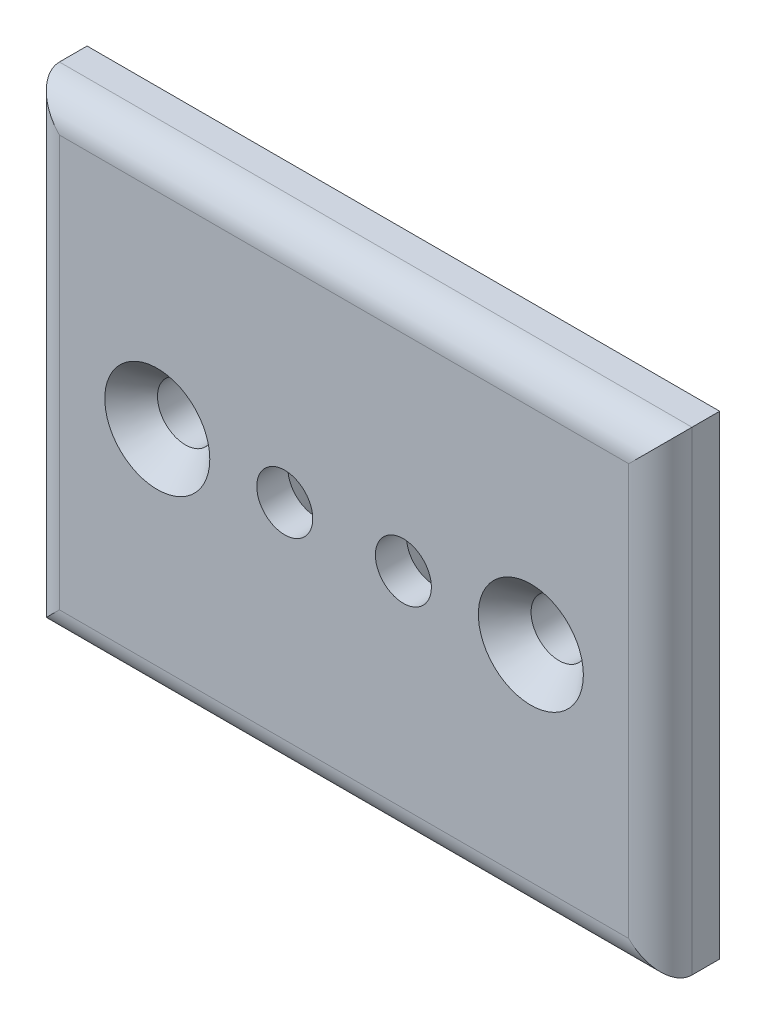
ISO-10303-21;
HEADER;
FILE_DESCRIPTION(('STEP AP214'),'2;1');
FILE_NAME('part.step','',(''),(''),'','','');
FILE_SCHEMA(('AUTOMOTIVE_DESIGN { 1 0 10303 214 1 1 1 1 }'));
ENDSEC;
DATA;
#1=APPLICATION_CONTEXT('core data for automotive mechanical design processes');
#2=APPLICATION_PROTOCOL_DEFINITION('international standard','automotive_design',2000,#1);
#3=PRODUCT_CONTEXT('',#1,'mechanical');
#4=PRODUCT('Part','Part','',(#3));
#5=PRODUCT_RELATED_PRODUCT_CATEGORY('part','',(#4));
#6=PRODUCT_DEFINITION_FORMATION('','',#4);
#7=PRODUCT_DEFINITION_CONTEXT('part definition',#1,'design');
#8=PRODUCT_DEFINITION('design','',#6,#7);
#9=PRODUCT_DEFINITION_SHAPE('','',#8);
#10=(LENGTH_UNIT() NAMED_UNIT(*) SI_UNIT(.MILLI.,.METRE.));
#11=(NAMED_UNIT(*) PLANE_ANGLE_UNIT() SI_UNIT($,.RADIAN.));
#12=(NAMED_UNIT(*) SI_UNIT($,.STERADIAN.) SOLID_ANGLE_UNIT());
#13=UNCERTAINTY_MEASURE_WITH_UNIT(LENGTH_MEASURE(1.E-05),#10,'distance_accuracy_value','');
#14=(GEOMETRIC_REPRESENTATION_CONTEXT(3) GLOBAL_UNCERTAINTY_ASSIGNED_CONTEXT((#13)) GLOBAL_UNIT_ASSIGNED_CONTEXT((#10,
#11,#12)) REPRESENTATION_CONTEXT('',''));
#15=CARTESIAN_POINT('',(0.,0.,0.));
#16=DIRECTION('',(0.,0.,1.));
#17=DIRECTION('',(1.,0.,0.));
#18=AXIS2_PLACEMENT_3D('',#15,#16,#17);
#19=CARTESIAN_POINT('',(25.4,19.05,4.7625));
#20=DIRECTION('',(-1.,0.,0.));
#21=DIRECTION('',(0.,-1.,0.));
#22=AXIS2_PLACEMENT_3D('',#19,#20,#21);
#23=PLANE('',#22);
#24=DIRECTION('',(0.,0.,-1.));
#25=VECTOR('',#24,1.);
#26=CARTESIAN_POINT('',(25.4,19.05,4.7625));
#27=LINE('',#26,#25);
#28=CARTESIAN_POINT('',(25.4,19.05,2.2225));
#29=VERTEX_POINT('',#28);
#30=CARTESIAN_POINT('',(25.4,19.05,0.));
#31=VERTEX_POINT('',#30);
#32=EDGE_CURVE('E86',#29,#31,#27,.T.);
#33=ORIENTED_EDGE('',*,*,#32,.F.);
#34=DIRECTION('',(0.,1.,0.));
#35=VECTOR('',#34,1.);
#36=CARTESIAN_POINT('',(25.4,-19.05,2.2225));
#37=LINE('',#36,#35);
#38=CARTESIAN_POINT('',(25.4,-19.05,2.2225));
#39=VERTEX_POINT('',#38);
#40=EDGE_CURVE('E56',#29,#39,#37,.F.);
#41=ORIENTED_EDGE('',*,*,#40,.T.);
#42=DIRECTION('',(0.,0.,-1.));
#43=VECTOR('',#42,1.);
#44=CARTESIAN_POINT('',(25.4,-19.05,4.7625));
#45=LINE('',#44,#43);
#46=CARTESIAN_POINT('',(25.4,-19.05,0.));
#47=VERTEX_POINT('',#46);
#48=EDGE_CURVE('E106',#39,#47,#45,.T.);
#49=ORIENTED_EDGE('',*,*,#48,.T.);
#50=DIRECTION('',(0.,1.,0.));
#51=VECTOR('',#50,1.);
#52=CARTESIAN_POINT('',(25.4,19.05,0.));
#53=LINE('',#52,#51);
#54=EDGE_CURVE('E102',#47,#31,#53,.T.);
#55=ORIENTED_EDGE('',*,*,#54,.T.);
#56=EDGE_LOOP('',(#33,#41,#49,#55));
#57=FACE_BOUND('',#56,.T.);
#58=ADVANCED_FACE('F32',(#57),#23,.F.);
#59=CARTESIAN_POINT('',(-25.4,19.05,4.7625));
#60=DIRECTION('',(0.,-1.,0.));
#61=DIRECTION('',(0.,0.,-1.));
#62=AXIS2_PLACEMENT_3D('',#59,#60,#61);
#63=PLANE('',#62);
#64=DIRECTION('',(0.,0.,-1.));
#65=VECTOR('',#64,1.);
#66=CARTESIAN_POINT('',(-25.4,19.05,4.7625));
#67=LINE('',#66,#65);
#68=CARTESIAN_POINT('',(-25.4,19.05,2.2225));
#69=VERTEX_POINT('',#68);
#70=CARTESIAN_POINT('',(-25.4,19.05,0.));
#71=VERTEX_POINT('',#70);
#72=EDGE_CURVE('E96',#69,#71,#67,.T.);
#73=ORIENTED_EDGE('',*,*,#72,.F.);
#74=DIRECTION('',(-1.,0.,0.));
#75=VECTOR('',#74,1.);
#76=CARTESIAN_POINT('',(25.4,19.05,2.2225));
#77=LINE('',#76,#75);
#78=EDGE_CURVE('E93',#69,#29,#77,.F.);
#79=ORIENTED_EDGE('',*,*,#78,.T.);
#80=ORIENTED_EDGE('',*,*,#32,.T.);
#81=DIRECTION('',(-1.,0.,0.));
#82=VECTOR('',#81,1.);
#83=CARTESIAN_POINT('',(-25.4,19.05,0.));
#84=LINE('',#83,#82);
#85=EDGE_CURVE('E90',#31,#71,#84,.T.);
#86=ORIENTED_EDGE('',*,*,#85,.T.);
#87=EDGE_LOOP('',(#73,#79,#80,#86));
#88=FACE_BOUND('',#87,.T.);
#89=ADVANCED_FACE('F89',(#88),#63,.F.);
#90=CARTESIAN_POINT('',(-25.4,19.05,4.7625));
#91=DIRECTION('',(1.,0.,0.));
#92=DIRECTION('',(0.,1.,0.));
#93=AXIS2_PLACEMENT_3D('',#90,#91,#92);
#94=PLANE('',#93);
#95=DIRECTION('',(0.,0.,-1.));
#96=VECTOR('',#95,1.);
#97=CARTESIAN_POINT('',(-25.4,-19.05,4.7625));
#98=LINE('',#97,#96);
#99=CARTESIAN_POINT('',(-25.4,-19.05,2.2225));
#100=VERTEX_POINT('',#99);
#101=CARTESIAN_POINT('',(-25.4,-19.05,0.));
#102=VERTEX_POINT('',#101);
#103=EDGE_CURVE('E119',#100,#102,#98,.T.);
#104=ORIENTED_EDGE('',*,*,#103,.F.);
#105=DIRECTION('',(0.,-1.,0.));
#106=VECTOR('',#105,1.);
#107=CARTESIAN_POINT('',(-25.4,19.05,2.2225));
#108=LINE('',#107,#106);
#109=EDGE_CURVE('E11',#100,#69,#108,.F.);
#110=ORIENTED_EDGE('',*,*,#109,.T.);
#111=ORIENTED_EDGE('',*,*,#72,.T.);
#112=DIRECTION('',(0.,-1.,0.));
#113=VECTOR('',#112,1.);
#114=CARTESIAN_POINT('',(-25.4,19.05,0.));
#115=LINE('',#114,#113);
#116=EDGE_CURVE('E104',#71,#102,#115,.T.);
#117=ORIENTED_EDGE('',*,*,#116,.T.);
#118=EDGE_LOOP('',(#104,#110,#111,#117));
#119=FACE_BOUND('',#118,.T.);
#120=ADVANCED_FACE('F201',(#119),#94,.F.);
#121=CARTESIAN_POINT('',(-25.4,-19.05,4.7625));
#122=DIRECTION('',(0.,1.,0.));
#123=DIRECTION('',(0.,0.,1.));
#124=AXIS2_PLACEMENT_3D('',#121,#122,#123);
#125=PLANE('',#124);
#126=ORIENTED_EDGE('',*,*,#48,.F.);
#127=DIRECTION('',(1.,0.,0.));
#128=VECTOR('',#127,1.);
#129=CARTESIAN_POINT('',(-25.4,-19.05,2.2225));
#130=LINE('',#129,#128);
#131=EDGE_CURVE('E41',#39,#100,#130,.F.);
#132=ORIENTED_EDGE('',*,*,#131,.T.);
#133=ORIENTED_EDGE('',*,*,#103,.T.);
#134=DIRECTION('',(1.,0.,0.));
#135=VECTOR('',#134,1.);
#136=CARTESIAN_POINT('',(-25.4,-19.05,0.));
#137=LINE('',#136,#135);
#138=EDGE_CURVE('E116',#102,#47,#137,.T.);
#139=ORIENTED_EDGE('',*,*,#138,.T.);
#140=EDGE_LOOP('',(#126,#132,#133,#139));
#141=FACE_BOUND('',#140,.T.);
#142=ADVANCED_FACE('F192',(#141),#125,.F.);
#143=CARTESIAN_POINT('',(25.4,-19.05,4.7625));
#144=DIRECTION('',(0.,0.,1.));
#145=DIRECTION('',(1.,0.,0.));
#146=AXIS2_PLACEMENT_3D('',#143,#144,#145);
#147=PLANE('',#146);
#148=DIRECTION('',(0.,1.,0.));
#149=VECTOR('',#148,1.);
#150=CARTESIAN_POINT('',(22.86,19.05,4.7625));
#151=LINE('',#150,#149);
#152=CARTESIAN_POINT('',(22.86,-16.51,4.7625));
#153=VERTEX_POINT('',#152);
#154=CARTESIAN_POINT('',(22.86,16.51,4.7625));
#155=VERTEX_POINT('',#154);
#156=EDGE_CURVE('E125',#153,#155,#151,.T.);
#157=ORIENTED_EDGE('',*,*,#156,.T.);
#158=DIRECTION('',(-1.,0.,0.));
#159=VECTOR('',#158,1.);
#160=CARTESIAN_POINT('',(-25.4,16.51,4.7625));
#161=LINE('',#160,#159);
#162=CARTESIAN_POINT('',(-22.86,16.51,4.7625));
#163=VERTEX_POINT('',#162);
#164=EDGE_CURVE('E127',#155,#163,#161,.T.);
#165=ORIENTED_EDGE('',*,*,#164,.T.);
#166=DIRECTION('',(0.,-1.,0.));
#167=VECTOR('',#166,1.);
#168=CARTESIAN_POINT('',(-22.86,-19.05,4.7625));
#169=LINE('',#168,#167);
#170=CARTESIAN_POINT('',(-22.86,-16.51,4.7625));
#171=VERTEX_POINT('',#170);
#172=EDGE_CURVE('E95',#163,#171,#169,.T.);
#173=ORIENTED_EDGE('',*,*,#172,.T.);
#174=DIRECTION('',(1.,0.,0.));
#175=VECTOR('',#174,1.);
#176=CARTESIAN_POINT('',(25.4,-16.51,4.7625));
#177=LINE('',#176,#175);
#178=EDGE_CURVE('E123',#171,#153,#177,.T.);
#179=ORIENTED_EDGE('',*,*,#178,.T.);
#180=EDGE_LOOP('',(#157,#165,#173,#179));
#181=FACE_BOUND('',#180,.T.);
#182=CARTESIAN_POINT('',(4.76249999999999,0.,4.7625));
#183=DIRECTION('',(0.,0.,-1.));
#184=DIRECTION('',(-1.,0.,0.));
#185=AXIS2_PLACEMENT_3D('',#182,#183,#184);
#186=CIRCLE('',#185,2.2479);
#187=CARTESIAN_POINT('',(2.51459999999999,0.,4.7625));
#188=VERTEX_POINT('',#187);
#189=EDGE_CURVE('E153',#188,#188,#186,.T.);
#190=ORIENTED_EDGE('',*,*,#189,.T.);
#191=EDGE_LOOP('',(#190));
#192=FACE_BOUND('',#191,.T.);
#193=CARTESIAN_POINT('',(-4.76250000000001,0.,4.7625));
#194=DIRECTION('',(0.,0.,-1.));
#195=DIRECTION('',(-1.,0.,0.));
#196=AXIS2_PLACEMENT_3D('',#193,#194,#195);
#197=CIRCLE('',#196,2.2479);
#198=CARTESIAN_POINT('',(-7.01040000000001,0.,4.7625));
#199=VERTEX_POINT('',#198);
#200=EDGE_CURVE('E164',#199,#199,#197,.T.);
#201=ORIENTED_EDGE('',*,*,#200,.T.);
#202=EDGE_LOOP('',(#201));
#203=FACE_BOUND('',#202,.T.);
#204=CARTESIAN_POINT('',(-15.,0.,4.7625));
#205=DIRECTION('',(0.,0.,1.));
#206=DIRECTION('',(1.,0.,0.));
#207=AXIS2_PLACEMENT_3D('',#204,#205,#206);
#208=CIRCLE('',#207,4.2164);
#209=CARTESIAN_POINT('',(-10.7836,0.,4.7625));
#210=VERTEX_POINT('',#209);
#211=EDGE_CURVE('E167',#210,#210,#208,.T.);
#212=ORIENTED_EDGE('',*,*,#211,.F.);
#213=EDGE_LOOP('',(#212));
#214=FACE_BOUND('',#213,.T.);
#215=CARTESIAN_POINT('',(15.,0.,4.7625));
#216=DIRECTION('',(0.,0.,1.));
#217=DIRECTION('',(1.,0.,0.));
#218=AXIS2_PLACEMENT_3D('',#215,#216,#217);
#219=CIRCLE('',#218,4.2164);
#220=CARTESIAN_POINT('',(19.2164,0.,4.7625));
#221=VERTEX_POINT('',#220);
#222=EDGE_CURVE('E176',#221,#221,#219,.T.);
#223=ORIENTED_EDGE('',*,*,#222,.F.);
#224=EDGE_LOOP('',(#223));
#225=FACE_BOUND('',#224,.T.);
#226=ADVANCED_FACE('F190',(#181,#192,#203,#214,#225),#147,.T.);
#227=CARTESIAN_POINT('',(25.4,-19.05,0.));
#228=DIRECTION('',(0.,0.,1.));
#229=DIRECTION('',(1.,0.,0.));
#230=AXIS2_PLACEMENT_3D('',#227,#228,#229);
#231=PLANE('',#230);
#232=CARTESIAN_POINT('',(4.76249999999999,0.,0.));
#233=DIRECTION('',(0.,0.,-1.));
#234=DIRECTION('',(-1.,0.,0.));
#235=AXIS2_PLACEMENT_3D('',#232,#233,#234);
#236=CIRCLE('',#235,4.2164);
#237=CARTESIAN_POINT('',(0.546099999999992,0.,0.));
#238=VERTEX_POINT('',#237);
#239=EDGE_CURVE('E143',#238,#238,#236,.T.);
#240=ORIENTED_EDGE('',*,*,#239,.F.);
#241=EDGE_LOOP('',(#240));
#242=FACE_BOUND('',#241,.T.);
#243=CARTESIAN_POINT('',(-4.76250000000001,0.,0.));
#244=DIRECTION('',(0.,0.,-1.));
#245=DIRECTION('',(-1.,0.,0.));
#246=AXIS2_PLACEMENT_3D('',#243,#244,#245);
#247=CIRCLE('',#246,4.2164);
#248=CARTESIAN_POINT('',(-8.97890000000001,0.,0.));
#249=VERTEX_POINT('',#248);
#250=EDGE_CURVE('E158',#249,#249,#247,.T.);
#251=ORIENTED_EDGE('',*,*,#250,.F.);
#252=EDGE_LOOP('',(#251));
#253=FACE_BOUND('',#252,.T.);
#254=CARTESIAN_POINT('',(-15.,0.,0.));
#255=DIRECTION('',(0.,0.,1.));
#256=DIRECTION('',(1.,0.,0.));
#257=AXIS2_PLACEMENT_3D('',#254,#255,#256);
#258=CIRCLE('',#257,2.2479);
#259=CARTESIAN_POINT('',(-12.7521,0.,0.));
#260=VERTEX_POINT('',#259);
#261=EDGE_CURVE('E173',#260,#260,#258,.T.);
#262=ORIENTED_EDGE('',*,*,#261,.T.);
#263=EDGE_LOOP('',(#262));
#264=FACE_BOUND('',#263,.T.);
#265=CARTESIAN_POINT('',(15.,0.,0.));
#266=DIRECTION('',(0.,0.,1.));
#267=DIRECTION('',(1.,0.,0.));
#268=AXIS2_PLACEMENT_3D('',#265,#266,#267);
#269=CIRCLE('',#268,2.2479);
#270=CARTESIAN_POINT('',(17.2479,0.,0.));
#271=VERTEX_POINT('',#270);
#272=EDGE_CURVE('E108',#271,#271,#269,.T.);
#273=ORIENTED_EDGE('',*,*,#272,.T.);
#274=EDGE_LOOP('',(#273));
#275=FACE_BOUND('',#274,.T.);
#276=ORIENTED_EDGE('',*,*,#54,.F.);
#277=ORIENTED_EDGE('',*,*,#138,.F.);
#278=ORIENTED_EDGE('',*,*,#116,.F.);
#279=ORIENTED_EDGE('',*,*,#85,.F.);
#280=EDGE_LOOP('',(#276,#277,#278,#279));
#281=FACE_BOUND('',#280,.T.);
#282=ADVANCED_FACE('F100',(#242,#253,#264,#275,#281),#231,.F.);
#283=CARTESIAN_POINT('',(15.,0.,4.7625));
#284=DIRECTION('',(0.,0.,1.));
#285=DIRECTION('',(1.,0.,0.));
#286=AXIS2_PLACEMENT_3D('',#283,#284,#285);
#287=CYLINDRICAL_SURFACE('',#286,2.2479);
#288=ORIENTED_EDGE('',*,*,#272,.F.);
#289=EDGE_LOOP('',(#288));
#290=FACE_BOUND('',#289,.T.);
#291=CARTESIAN_POINT('',(15.,0.,2.49799979038544));
#292=DIRECTION('',(0.,0.,1.));
#293=DIRECTION('',(1.,0.,0.));
#294=AXIS2_PLACEMENT_3D('',#291,#292,#293);
#295=CIRCLE('',#294,2.2479);
#296=CARTESIAN_POINT('',(17.2479,0.,2.49799979038544));
#297=VERTEX_POINT('',#296);
#298=EDGE_CURVE('E111',#297,#297,#295,.T.);
#299=ORIENTED_EDGE('',*,*,#298,.T.);
#300=EDGE_LOOP('',(#299));
#301=FACE_BOUND('',#300,.T.);
#302=ADVANCED_FACE('F181',(#290,#301),#287,.F.);
#303=CARTESIAN_POINT('',(15.,0.,4.7625));
#304=DIRECTION('',(0.,0.,1.));
#305=DIRECTION('',(1.,0.,0.));
#306=AXIS2_PLACEMENT_3D('',#303,#304,#305);
#307=CONICAL_SURFACE('',#306,4.2164,0.715584993317675);
#308=ORIENTED_EDGE('',*,*,#298,.F.);
#309=EDGE_LOOP('',(#308));
#310=FACE_BOUND('',#309,.T.);
#311=ORIENTED_EDGE('',*,*,#222,.T.);
#312=EDGE_LOOP('',(#311));
#313=FACE_BOUND('',#312,.T.);
#314=ADVANCED_FACE('F183',(#310,#313),#307,.F.);
#315=CARTESIAN_POINT('',(-15.,0.,4.7625));
#316=DIRECTION('',(0.,0.,1.));
#317=DIRECTION('',(1.,0.,0.));
#318=AXIS2_PLACEMENT_3D('',#315,#316,#317);
#319=CYLINDRICAL_SURFACE('',#318,2.2479);
#320=ORIENTED_EDGE('',*,*,#261,.F.);
#321=EDGE_LOOP('',(#320));
#322=FACE_BOUND('',#321,.T.);
#323=CARTESIAN_POINT('',(-15.,0.,2.49799979038544));
#324=DIRECTION('',(0.,0.,1.));
#325=DIRECTION('',(1.,0.,0.));
#326=AXIS2_PLACEMENT_3D('',#323,#324,#325);
#327=CIRCLE('',#326,2.2479);
#328=CARTESIAN_POINT('',(-12.7521,0.,2.49799979038544));
#329=VERTEX_POINT('',#328);
#330=EDGE_CURVE('E170',#329,#329,#327,.T.);
#331=ORIENTED_EDGE('',*,*,#330,.T.);
#332=EDGE_LOOP('',(#331));
#333=FACE_BOUND('',#332,.T.);
#334=ADVANCED_FACE('F186',(#322,#333),#319,.F.);
#335=CARTESIAN_POINT('',(-15.,0.,4.7625));
#336=DIRECTION('',(0.,0.,1.));
#337=DIRECTION('',(1.,0.,0.));
#338=AXIS2_PLACEMENT_3D('',#335,#336,#337);
#339=CONICAL_SURFACE('',#338,4.2164,0.715584993317675);
#340=ORIENTED_EDGE('',*,*,#330,.F.);
#341=EDGE_LOOP('',(#340));
#342=FACE_BOUND('',#341,.T.);
#343=ORIENTED_EDGE('',*,*,#211,.T.);
#344=EDGE_LOOP('',(#343));
#345=FACE_BOUND('',#344,.T.);
#346=ADVANCED_FACE('F304',(#342,#345),#339,.F.);
#347=CARTESIAN_POINT('',(-4.76250000000001,0.,0.));
#348=DIRECTION('',(0.,0.,-1.));
#349=DIRECTION('',(-1.,0.,0.));
#350=AXIS2_PLACEMENT_3D('',#347,#348,#349);
#351=CYLINDRICAL_SURFACE('',#350,2.2479);
#352=ORIENTED_EDGE('',*,*,#200,.F.);
#353=EDGE_LOOP('',(#352));
#354=FACE_BOUND('',#353,.T.);
#355=CARTESIAN_POINT('',(-4.76250000000001,0.,2.26450020961456));
#356=DIRECTION('',(0.,0.,-1.));
#357=DIRECTION('',(-1.,0.,0.));
#358=AXIS2_PLACEMENT_3D('',#355,#356,#357);
#359=CIRCLE('',#358,2.2479);
#360=CARTESIAN_POINT('',(-7.01040000000001,0.,2.26450020961456));
#361=VERTEX_POINT('',#360);
#362=EDGE_CURVE('E161',#361,#361,#359,.T.);
#363=ORIENTED_EDGE('',*,*,#362,.T.);
#364=EDGE_LOOP('',(#363));
#365=FACE_BOUND('',#364,.T.);
#366=ADVANCED_FACE('F295',(#354,#365),#351,.F.);
#367=CARTESIAN_POINT('',(-4.76250000000001,0.,0.));
#368=DIRECTION('',(0.,0.,-1.));
#369=DIRECTION('',(-1.,0.,0.));
#370=AXIS2_PLACEMENT_3D('',#367,#368,#369);
#371=CONICAL_SURFACE('',#370,4.2164,0.715584993317675);
#372=ORIENTED_EDGE('',*,*,#362,.F.);
#373=EDGE_LOOP('',(#372));
#374=FACE_BOUND('',#373,.T.);
#375=ORIENTED_EDGE('',*,*,#250,.T.);
#376=EDGE_LOOP('',(#375));
#377=FACE_BOUND('',#376,.T.);
#378=ADVANCED_FACE('F286',(#374,#377),#371,.F.);
#379=CARTESIAN_POINT('',(4.76249999999999,0.,0.));
#380=DIRECTION('',(0.,0.,-1.));
#381=DIRECTION('',(-1.,0.,0.));
#382=AXIS2_PLACEMENT_3D('',#379,#380,#381);
#383=CYLINDRICAL_SURFACE('',#382,2.2479);
#384=ORIENTED_EDGE('',*,*,#189,.F.);
#385=EDGE_LOOP('',(#384));
#386=FACE_BOUND('',#385,.T.);
#387=CARTESIAN_POINT('',(4.76249999999999,0.,2.26450020961456));
#388=DIRECTION('',(0.,0.,-1.));
#389=DIRECTION('',(-1.,0.,0.));
#390=AXIS2_PLACEMENT_3D('',#387,#388,#389);
#391=CIRCLE('',#390,2.2479);
#392=CARTESIAN_POINT('',(2.51459999999999,0.,2.26450020961456));
#393=VERTEX_POINT('',#392);
#394=EDGE_CURVE('E148',#393,#393,#391,.T.);
#395=ORIENTED_EDGE('',*,*,#394,.T.);
#396=EDGE_LOOP('',(#395));
#397=FACE_BOUND('',#396,.T.);
#398=ADVANCED_FACE('F229',(#386,#397),#383,.F.);
#399=CARTESIAN_POINT('',(4.76249999999999,0.,0.));
#400=DIRECTION('',(0.,0.,-1.));
#401=DIRECTION('',(-1.,0.,0.));
#402=AXIS2_PLACEMENT_3D('',#399,#400,#401);
#403=CONICAL_SURFACE('',#402,4.2164,0.715584993317675);
#404=ORIENTED_EDGE('',*,*,#394,.F.);
#405=EDGE_LOOP('',(#404));
#406=FACE_BOUND('',#405,.T.);
#407=ORIENTED_EDGE('',*,*,#239,.T.);
#408=EDGE_LOOP('',(#407));
#409=FACE_BOUND('',#408,.T.);
#410=ADVANCED_FACE('F224',(#406,#409),#403,.F.);
#411=CARTESIAN_POINT('',(25.4,-16.51,2.2225));
#412=DIRECTION('',(-1.,0.,0.));
#413=DIRECTION('',(0.,0.,1.));
#414=AXIS2_PLACEMENT_3D('',#411,#412,#413);
#415=CYLINDRICAL_SURFACE('',#414,2.54);
#416=CARTESIAN_POINT('',(-22.86,-16.51,2.2225));
#417=DIRECTION('',(-0.707106781186547,0.707106781186547,0.));
#418=DIRECTION('',(0.707106781186547,0.707106781186548,0.));
#419=AXIS2_PLACEMENT_3D('',#416,#417,#418);
#420=ELLIPSE('',#419,3.59210244842766,2.54);
#421=EDGE_CURVE('E136',#100,#171,#420,.T.);
#422=ORIENTED_EDGE('',*,*,#421,.F.);
#423=ORIENTED_EDGE('',*,*,#131,.F.);
#424=CARTESIAN_POINT('',(22.86,-16.51,2.2225));
#425=DIRECTION('',(-0.707106781186547,-0.707106781186548,0.));
#426=DIRECTION('',(-0.707106781186547,0.707106781186547,0.));
#427=AXIS2_PLACEMENT_3D('',#424,#425,#426);
#428=ELLIPSE('',#427,3.59210244842766,2.54);
#429=EDGE_CURVE('E36',#153,#39,#428,.F.);
#430=ORIENTED_EDGE('',*,*,#429,.F.);
#431=ORIENTED_EDGE('',*,*,#178,.F.);
#432=EDGE_LOOP('',(#422,#423,#430,#431));
#433=FACE_BOUND('',#432,.T.);
#434=ADVANCED_FACE('F34',(#433),#415,.T.);
#435=CARTESIAN_POINT('',(22.86,-19.05,2.2225));
#436=DIRECTION('',(0.,-1.,0.));
#437=DIRECTION('',(1.,0.,0.));
#438=AXIS2_PLACEMENT_3D('',#435,#436,#437);
#439=CYLINDRICAL_SURFACE('',#438,2.54);
#440=ORIENTED_EDGE('',*,*,#429,.T.);
#441=ORIENTED_EDGE('',*,*,#40,.F.);
#442=CARTESIAN_POINT('',(22.86,16.51,2.2225));
#443=DIRECTION('',(0.707106781186547,-0.707106781186547,0.));
#444=DIRECTION('',(-0.707106781186547,-0.707106781186548,0.));
#445=AXIS2_PLACEMENT_3D('',#442,#443,#444);
#446=ELLIPSE('',#445,3.59210244842766,2.54);
#447=EDGE_CURVE('E135',#155,#29,#446,.F.);
#448=ORIENTED_EDGE('',*,*,#447,.F.);
#449=ORIENTED_EDGE('',*,*,#156,.F.);
#450=EDGE_LOOP('',(#440,#441,#448,#449));
#451=FACE_BOUND('',#450,.T.);
#452=ADVANCED_FACE('F219',(#451),#439,.T.);
#453=CARTESIAN_POINT('',(-22.86,-19.05,2.2225));
#454=DIRECTION('',(0.,1.,0.));
#455=DIRECTION('',(-1.,0.,0.));
#456=AXIS2_PLACEMENT_3D('',#453,#454,#455);
#457=CYLINDRICAL_SURFACE('',#456,2.54);
#458=ORIENTED_EDGE('',*,*,#421,.T.);
#459=ORIENTED_EDGE('',*,*,#172,.F.);
#460=CARTESIAN_POINT('',(-22.86,16.51,2.2225));
#461=DIRECTION('',(0.707106781186547,0.707106781186548,0.));
#462=DIRECTION('',(-0.707106781186547,0.707106781186547,0.));
#463=AXIS2_PLACEMENT_3D('',#460,#461,#462);
#464=ELLIPSE('',#463,3.59210244842766,2.54);
#465=EDGE_CURVE('E133',#69,#163,#464,.T.);
#466=ORIENTED_EDGE('',*,*,#465,.F.);
#467=ORIENTED_EDGE('',*,*,#109,.F.);
#468=EDGE_LOOP('',(#458,#459,#466,#467));
#469=FACE_BOUND('',#468,.T.);
#470=ADVANCED_FACE('F216',(#469),#457,.T.);
#471=CARTESIAN_POINT('',(25.4,16.51,2.2225));
#472=DIRECTION('',(1.,0.,0.));
#473=DIRECTION('',(0.,0.,-1.));
#474=AXIS2_PLACEMENT_3D('',#471,#472,#473);
#475=CYLINDRICAL_SURFACE('',#474,2.54);
#476=ORIENTED_EDGE('',*,*,#447,.T.);
#477=ORIENTED_EDGE('',*,*,#78,.F.);
#478=ORIENTED_EDGE('',*,*,#465,.T.);
#479=ORIENTED_EDGE('',*,*,#164,.F.);
#480=EDGE_LOOP('',(#476,#477,#478,#479));
#481=FACE_BOUND('',#480,.T.);
#482=ADVANCED_FACE('F213',(#481),#475,.T.);
#483=CLOSED_SHELL('',(#58,#89,#120,#142,#226,#282,#302,#314,#334,#346,#366,#378,#398,#410,#434,
#452,#470,#482));
#484=MANIFOLD_SOLID_BREP('B2',#483);
#485=ADVANCED_BREP_SHAPE_REPRESENTATION('',(#18,#484),#14);
#486=SHAPE_DEFINITION_REPRESENTATION(#9,#485);
ENDSEC;
END-ISO-10303-21;
